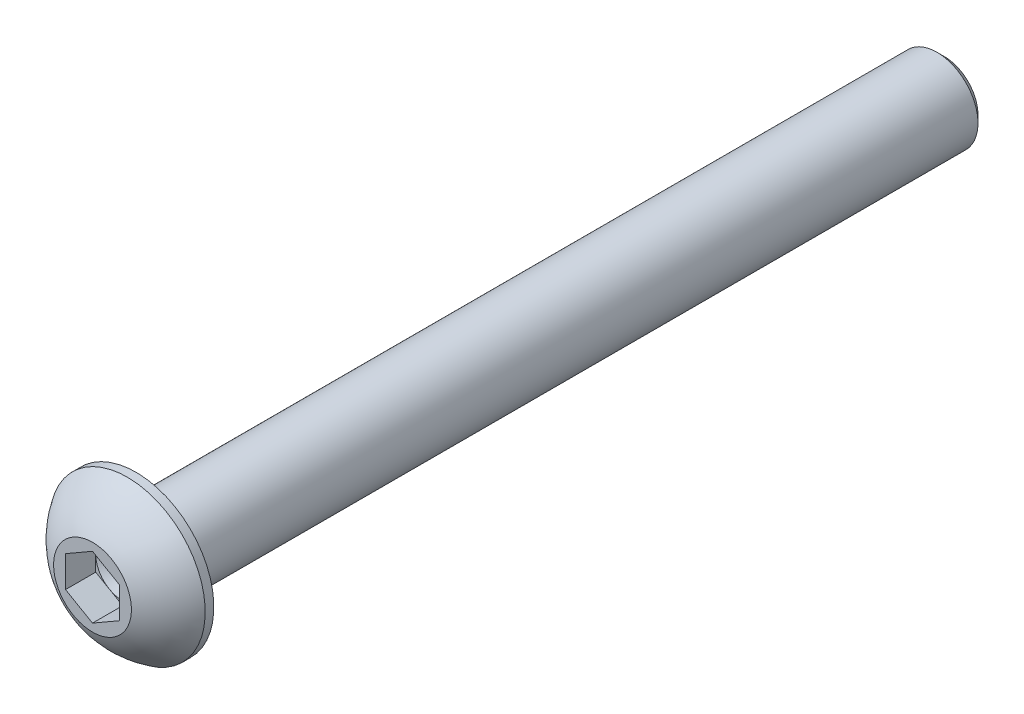
ISO-10303-21;
HEADER;
FILE_DESCRIPTION(('STEP AP214'),'2;1');
FILE_NAME('part.step','',(''),(''),'','','');
FILE_SCHEMA(('AUTOMOTIVE_DESIGN { 1 0 10303 214 1 1 1 1 }'));
ENDSEC;
DATA;
#1=APPLICATION_CONTEXT('core data for automotive mechanical design processes');
#2=APPLICATION_PROTOCOL_DEFINITION('international standard','automotive_design',2000,#1);
#3=PRODUCT_CONTEXT('',#1,'mechanical');
#4=PRODUCT('Part','Part','',(#3));
#5=PRODUCT_RELATED_PRODUCT_CATEGORY('part','',(#4));
#6=PRODUCT_DEFINITION_FORMATION('','',#4);
#7=PRODUCT_DEFINITION_CONTEXT('part definition',#1,'design');
#8=PRODUCT_DEFINITION('design','',#6,#7);
#9=PRODUCT_DEFINITION_SHAPE('','',#8);
#10=(LENGTH_UNIT() NAMED_UNIT(*) SI_UNIT(.MILLI.,.METRE.));
#11=(NAMED_UNIT(*) PLANE_ANGLE_UNIT() SI_UNIT($,.RADIAN.));
#12=(NAMED_UNIT(*) SI_UNIT($,.STERADIAN.) SOLID_ANGLE_UNIT());
#13=UNCERTAINTY_MEASURE_WITH_UNIT(LENGTH_MEASURE(1.E-05),#10,'distance_accuracy_value','');
#14=(GEOMETRIC_REPRESENTATION_CONTEXT(3) GLOBAL_UNCERTAINTY_ASSIGNED_CONTEXT((#13)) GLOBAL_UNIT_ASSIGNED_CONTEXT((#10,
#11,#12)) REPRESENTATION_CONTEXT('',''));
#15=CARTESIAN_POINT('',(0.,0.,0.));
#16=DIRECTION('',(0.,0.,1.));
#17=DIRECTION('',(1.,0.,0.));
#18=AXIS2_PLACEMENT_3D('',#15,#16,#17);
#19=CARTESIAN_POINT('',(0.,0.,-1.778));
#20=DIRECTION('',(0.,0.,1.));
#21=DIRECTION('',(1.,0.,0.));
#22=AXIS2_PLACEMENT_3D('',#19,#20,#21);
#23=PLANE('',#22);
#24=CARTESIAN_POINT('',(0.,0.,-1.778));
#25=DIRECTION('',(0.,0.,1.));
#26=DIRECTION('',(1.,0.,0.));
#27=AXIS2_PLACEMENT_3D('',#24,#25,#26);
#28=CIRCLE('',#27,1.5875);
#29=CARTESIAN_POINT('',(1.5875,0.,-1.778));
#30=VERTEX_POINT('',#29);
#31=CARTESIAN_POINT('',(0.79375,1.3748153285078,-1.778));
#32=VERTEX_POINT('',#31);
#33=EDGE_CURVE('E96',#30,#32,#28,.T.);
#34=ORIENTED_EDGE('',*,*,#33,.F.);
#35=DIRECTION('',(0.,-1.,0.));
#36=VECTOR('',#35,1.);
#37=CARTESIAN_POINT('',(1.5875,0.,-1.778));
#38=LINE('',#37,#36);
#39=CARTESIAN_POINT('',(1.5875,0.916543552338531,-1.778));
#40=VERTEX_POINT('',#39);
#41=EDGE_CURVE('E120',#40,#30,#38,.T.);
#42=ORIENTED_EDGE('',*,*,#41,.F.);
#43=DIRECTION('',(0.866025403784438,-0.5,0.));
#44=VECTOR('',#43,1.);
#45=CARTESIAN_POINT('',(0.79375,1.3748153285078,-1.778));
#46=LINE('',#45,#44);
#47=EDGE_CURVE('E118',#32,#40,#46,.T.);
#48=ORIENTED_EDGE('',*,*,#47,.F.);
#49=EDGE_LOOP('',(#34,#42,#48));
#50=FACE_BOUND('',#49,.T.);
#51=ADVANCED_FACE('F17',(#50),#23,.T.);
#52=CARTESIAN_POINT('',(-0.79375,1.37481532850779,-1.778));
#53=VERTEX_POINT('',#52);
#54=EDGE_CURVE('E98',#32,#53,#28,.T.);
#55=ORIENTED_EDGE('',*,*,#54,.F.);
#56=CARTESIAN_POINT('',(0.,1.83308710467706,-1.778));
#57=VERTEX_POINT('',#56);
#58=EDGE_CURVE('E113',#57,#32,#46,.T.);
#59=ORIENTED_EDGE('',*,*,#58,.F.);
#60=DIRECTION('',(0.866025403784437,0.5,0.));
#61=VECTOR('',#60,1.);
#62=CARTESIAN_POINT('',(-0.79375,1.37481532850779,-1.778));
#63=LINE('',#62,#61);
#64=EDGE_CURVE('E114',#53,#57,#63,.T.);
#65=ORIENTED_EDGE('',*,*,#64,.F.);
#66=EDGE_LOOP('',(#55,#59,#65));
#67=FACE_BOUND('',#66,.T.);
#68=ADVANCED_FACE('F111',(#67),#23,.T.);
#69=CARTESIAN_POINT('',(-1.5875,0.,-1.778));
#70=VERTEX_POINT('',#69);
#71=EDGE_CURVE('E117',#53,#70,#28,.T.);
#72=ORIENTED_EDGE('',*,*,#71,.F.);
#73=CARTESIAN_POINT('',(-1.5875,0.916543552338527,-1.778));
#74=VERTEX_POINT('',#73);
#75=EDGE_CURVE('E135',#74,#53,#63,.T.);
#76=ORIENTED_EDGE('',*,*,#75,.F.);
#77=DIRECTION('',(0.,1.,0.));
#78=VECTOR('',#77,1.);
#79=CARTESIAN_POINT('',(-1.5875,0.,-1.778));
#80=LINE('',#79,#78);
#81=EDGE_CURVE('E139',#70,#74,#80,.T.);
#82=ORIENTED_EDGE('',*,*,#81,.F.);
#83=EDGE_LOOP('',(#72,#76,#82));
#84=FACE_BOUND('',#83,.T.);
#85=ADVANCED_FACE('F226',(#84),#23,.T.);
#86=CARTESIAN_POINT('',(-0.79375,-1.3748153285078,-1.778));
#87=VERTEX_POINT('',#86);
#88=EDGE_CURVE('E251',#70,#87,#28,.T.);
#89=ORIENTED_EDGE('',*,*,#88,.F.);
#90=CARTESIAN_POINT('',(-1.5875,-0.916543552338531,-1.778));
#91=VERTEX_POINT('',#90);
#92=EDGE_CURVE('E140',#91,#70,#80,.T.);
#93=ORIENTED_EDGE('',*,*,#92,.F.);
#94=DIRECTION('',(-0.866025403784438,0.5,0.));
#95=VECTOR('',#94,1.);
#96=CARTESIAN_POINT('',(-0.79375,-1.3748153285078,-1.778));
#97=LINE('',#96,#95);
#98=EDGE_CURVE('E143',#87,#91,#97,.T.);
#99=ORIENTED_EDGE('',*,*,#98,.F.);
#100=EDGE_LOOP('',(#89,#93,#99));
#101=FACE_BOUND('',#100,.T.);
#102=ADVANCED_FACE('F238',(#101),#23,.T.);
#103=CARTESIAN_POINT('',(0.79375,-1.37481532850779,-1.778));
#104=VERTEX_POINT('',#103);
#105=EDGE_CURVE('E33',#87,#104,#28,.T.);
#106=ORIENTED_EDGE('',*,*,#105,.F.);
#107=CARTESIAN_POINT('',(0.,-1.83308710467706,-1.778));
#108=VERTEX_POINT('',#107);
#109=EDGE_CURVE('E144',#108,#87,#97,.T.);
#110=ORIENTED_EDGE('',*,*,#109,.F.);
#111=DIRECTION('',(-0.866025403784437,-0.5,0.));
#112=VECTOR('',#111,1.);
#113=CARTESIAN_POINT('',(0.79375,-1.37481532850779,-1.778));
#114=LINE('',#113,#112);
#115=EDGE_CURVE('E148',#104,#108,#114,.T.);
#116=ORIENTED_EDGE('',*,*,#115,.F.);
#117=EDGE_LOOP('',(#106,#110,#116));
#118=FACE_BOUND('',#117,.T.);
#119=ADVANCED_FACE('F231',(#118),#23,.T.);
#120=CARTESIAN_POINT('',(-1.146175,0.,0.));
#121=DIRECTION('',(0.,0.,1.));
#122=DIRECTION('',(1.,0.,0.));
#123=AXIS2_PLACEMENT_3D('',#120,#121,#122);
#124=PLANE('',#123);
#125=CARTESIAN_POINT('',(0.,0.,0.));
#126=DIRECTION('',(0.,0.,-1.));
#127=DIRECTION('',(-1.,0.,0.));
#128=AXIS2_PLACEMENT_3D('',#125,#126,#127);
#129=CIRCLE('',#128,2.29235);
#130=CARTESIAN_POINT('',(-2.29235000000001,0.,0.));
#131=VERTEX_POINT('',#130);
#132=EDGE_CURVE('E196',#131,#131,#129,.T.);
#133=ORIENTED_EDGE('',*,*,#132,.F.);
#134=EDGE_LOOP('',(#133));
#135=FACE_BOUND('',#134,.T.);
#136=DIRECTION('',(0.866025403784437,0.5,0.));
#137=VECTOR('',#136,1.);
#138=CARTESIAN_POINT('',(-0.79375,1.37481532850779,0.));
#139=LINE('',#138,#137);
#140=CARTESIAN_POINT('',(-1.5875,0.916543552338527,0.));
#141=VERTEX_POINT('',#140);
#142=CARTESIAN_POINT('',(0.,1.83308710467706,0.));
#143=VERTEX_POINT('',#142);
#144=EDGE_CURVE('E160',#141,#143,#139,.T.);
#145=ORIENTED_EDGE('',*,*,#144,.T.);
#146=DIRECTION('',(0.866025403784438,-0.5,0.));
#147=VECTOR('',#146,1.);
#148=CARTESIAN_POINT('',(0.79375,1.3748153285078,0.));
#149=LINE('',#148,#147);
#150=CARTESIAN_POINT('',(1.5875,0.916543552338531,0.));
#151=VERTEX_POINT('',#150);
#152=EDGE_CURVE('E106',#143,#151,#149,.T.);
#153=ORIENTED_EDGE('',*,*,#152,.T.);
#154=DIRECTION('',(0.,-1.,0.));
#155=VECTOR('',#154,1.);
#156=CARTESIAN_POINT('',(1.5875,0.,0.));
#157=LINE('',#156,#155);
#158=CARTESIAN_POINT('',(1.5875,-0.916543552338531,0.));
#159=VERTEX_POINT('',#158);
#160=EDGE_CURVE('E124',#151,#159,#157,.T.);
#161=ORIENTED_EDGE('',*,*,#160,.T.);
#162=DIRECTION('',(-0.866025403784437,-0.5,0.));
#163=VECTOR('',#162,1.);
#164=CARTESIAN_POINT('',(0.79375,-1.37481532850779,0.));
#165=LINE('',#164,#163);
#166=CARTESIAN_POINT('',(0.,-1.83308710467706,0.));
#167=VERTEX_POINT('',#166);
#168=EDGE_CURVE('E41',#159,#167,#165,.T.);
#169=ORIENTED_EDGE('',*,*,#168,.T.);
#170=DIRECTION('',(-0.866025403784438,0.5,0.));
#171=VECTOR('',#170,1.);
#172=CARTESIAN_POINT('',(-0.79375,-1.3748153285078,0.));
#173=LINE('',#172,#171);
#174=CARTESIAN_POINT('',(-1.5875,-0.916543552338531,0.));
#175=VERTEX_POINT('',#174);
#176=EDGE_CURVE('E168',#167,#175,#173,.T.);
#177=ORIENTED_EDGE('',*,*,#176,.T.);
#178=DIRECTION('',(0.,1.,0.));
#179=VECTOR('',#178,1.);
#180=CARTESIAN_POINT('',(-1.5875,0.,0.));
#181=LINE('',#180,#179);
#182=EDGE_CURVE('E164',#175,#141,#181,.T.);
#183=ORIENTED_EDGE('',*,*,#182,.T.);
#184=EDGE_LOOP('',(#145,#153,#161,#169,#177,#183));
#185=FACE_BOUND('',#184,.T.);
#186=ADVANCED_FACE('F237',(#135,#185),#124,.T.);
#187=CARTESIAN_POINT('',(0.,0.,1.48381805047393));
#188=DIRECTION('',(0.,0.,-1.));
#189=DIRECTION('',(-1.,0.,0.));
#190=AXIS2_PLACEMENT_3D('',#187,#188,#189);
#191=CYLINDRICAL_SURFACE('',#190,4.5847);
#192=CARTESIAN_POINT('',(0.,0.,-2.0574));
#193=DIRECTION('',(0.,0.,-1.));
#194=DIRECTION('',(-1.,0.,0.));
#195=AXIS2_PLACEMENT_3D('',#192,#193,#194);
#196=CIRCLE('',#195,4.5847);
#197=CARTESIAN_POINT('',(-4.5847,0.,-2.0574));
#198=VERTEX_POINT('',#197);
#199=EDGE_CURVE('E192',#198,#198,#196,.T.);
#200=ORIENTED_EDGE('',*,*,#199,.T.);
#201=EDGE_LOOP('',(#200));
#202=FACE_BOUND('',#201,.T.);
#203=CARTESIAN_POINT('',(0.,0.,-2.5654));
#204=DIRECTION('',(0.,0.,-1.));
#205=DIRECTION('',(-1.,0.,0.));
#206=AXIS2_PLACEMENT_3D('',#203,#204,#205);
#207=CIRCLE('',#206,4.5847);
#208=CARTESIAN_POINT('',(-4.5847,0.,-2.5654));
#209=VERTEX_POINT('',#208);
#210=EDGE_CURVE('E208',#209,#209,#207,.T.);
#211=ORIENTED_EDGE('',*,*,#210,.F.);
#212=EDGE_LOOP('',(#211));
#213=FACE_BOUND('',#212,.T.);
#214=ADVANCED_FACE('F243',(#202,#213),#191,.T.);
#215=CARTESIAN_POINT('',(-3.68935,0.,-2.5654));
#216=DIRECTION('',(0.,0.,-1.));
#217=DIRECTION('',(-1.,0.,0.));
#218=AXIS2_PLACEMENT_3D('',#215,#216,#217);
#219=PLANE('',#218);
#220=ORIENTED_EDGE('',*,*,#210,.T.);
#221=EDGE_LOOP('',(#220));
#222=FACE_BOUND('',#221,.T.);
#223=CARTESIAN_POINT('',(0.,0.,-2.5654));
#224=DIRECTION('',(0.,0.,-1.));
#225=DIRECTION('',(-1.,0.,0.));
#226=AXIS2_PLACEMENT_3D('',#223,#224,#225);
#227=CIRCLE('',#226,2.794);
#228=CARTESIAN_POINT('',(-2.794,0.,-2.5654));
#229=VERTEX_POINT('',#228);
#230=EDGE_CURVE('E204',#229,#229,#227,.T.);
#231=ORIENTED_EDGE('',*,*,#230,.F.);
#232=EDGE_LOOP('',(#231));
#233=FACE_BOUND('',#232,.T.);
#234=ADVANCED_FACE('F311',(#222,#233),#219,.T.);
#235=CARTESIAN_POINT('',(0.,0.,-2.9464));
#236=DIRECTION('',(0.,0.,-1.));
#237=DIRECTION('',(-1.,0.,0.));
#238=AXIS2_PLACEMENT_3D('',#235,#236,#237);
#239=TOROIDAL_SURFACE('',#238,2.794,0.381);
#240=ORIENTED_EDGE('',*,*,#230,.T.);
#241=EDGE_LOOP('',(#240));
#242=FACE_BOUND('',#241,.T.);
#243=CARTESIAN_POINT('',(0.,0.,-2.9464));
#244=DIRECTION('',(0.,0.,-1.));
#245=DIRECTION('',(-1.,0.,0.));
#246=AXIS2_PLACEMENT_3D('',#243,#244,#245);
#247=CIRCLE('',#246,2.413);
#248=CARTESIAN_POINT('',(-2.413,0.,-2.9464));
#249=VERTEX_POINT('',#248);
#250=EDGE_CURVE('E200',#249,#249,#247,.T.);
#251=ORIENTED_EDGE('',*,*,#250,.F.);
#252=EDGE_LOOP('',(#251));
#253=FACE_BOUND('',#252,.T.);
#254=ADVANCED_FACE('F319',(#242,#253),#239,.F.);
#255=CARTESIAN_POINT('',(0.,0.,1.48381805047393));
#256=DIRECTION('',(0.,0.,-1.));
#257=DIRECTION('',(-1.,0.,0.));
#258=AXIS2_PLACEMENT_3D('',#255,#256,#257);
#259=CYLINDRICAL_SURFACE('',#258,2.413);
#260=CARTESIAN_POINT('',(0.,0.,-49.76145761938));
#261=DIRECTION('',(0.,0.,-1.));
#262=DIRECTION('',(-1.,0.,0.));
#263=AXIS2_PLACEMENT_3D('',#260,#261,#262);
#264=CIRCLE('',#263,2.413);
#265=CARTESIAN_POINT('',(-2.413,0.,-49.76145761938));
#266=VERTEX_POINT('',#265);
#267=EDGE_CURVE('E11',#266,#266,#264,.F.);
#268=ORIENTED_EDGE('',*,*,#267,.T.);
#269=EDGE_LOOP('',(#268));
#270=FACE_BOUND('',#269,.T.);
#271=ORIENTED_EDGE('',*,*,#250,.T.);
#272=EDGE_LOOP('',(#271));
#273=FACE_BOUND('',#272,.T.);
#274=ADVANCED_FACE('F328',(#270,#273),#259,.T.);
#275=CARTESIAN_POINT('',(-1.2065,0.,-50.1904));
#276=DIRECTION('',(0.,0.,-1.));
#277=DIRECTION('',(-1.,0.,0.));
#278=AXIS2_PLACEMENT_3D('',#275,#276,#277);
#279=PLANE('',#278);
#280=CARTESIAN_POINT('',(0.,0.,-50.1904));
#281=DIRECTION('',(0.,0.,-1.));
#282=DIRECTION('',(-1.,0.,0.));
#283=AXIS2_PLACEMENT_3D('',#280,#281,#282);
#284=CIRCLE('',#283,1.98405761938);
#285=CARTESIAN_POINT('',(-1.98405761938,0.,-50.1904));
#286=VERTEX_POINT('',#285);
#287=EDGE_CURVE('E26',#286,#286,#284,.T.);
#288=ORIENTED_EDGE('',*,*,#287,.T.);
#289=EDGE_LOOP('',(#288));
#290=FACE_BOUND('',#289,.T.);
#291=ADVANCED_FACE('F215',(#290),#279,.T.);
#292=CARTESIAN_POINT('',(0.,0.,-4.85989606481481));
#293=DIRECTION('',(0.,0.,-1.));
#294=DIRECTION('',(-1.,0.,0.));
#295=AXIS2_PLACEMENT_3D('',#292,#293,#294);
#296=SPHERICAL_SURFACE('',#295,5.37340285883187);
#297=CARTESIAN_POINT('',(-4.5847,0.,-2.0574));
#298=CARTESIAN_POINT('',(-4.56772775071365,0.,-2.02963444466225));
#299=CARTESIAN_POINT('',(-4.55050321576171,0.,-2.00202310563314));
#300=CARTESIAN_POINT('',(-4.51555538986232,0.,-1.94711789153313));
#301=CARTESIAN_POINT('',(-4.49783209891487,0.,-1.91982401646224));
#302=CARTESIAN_POINT('',(-4.4618925763601,0.,-1.8655627616196));
#303=CARTESIAN_POINT('',(-4.44367634475278,0.,-1.83859538184787));
#304=CARTESIAN_POINT('',(-4.40675696303686,0.,-1.78499601309644));
#305=CARTESIAN_POINT('',(-4.38805381292827,0.,-1.75836402411674));
#306=CARTESIAN_POINT('',(-4.35016676527117,0.,-1.70544422925954));
#307=CARTESIAN_POINT('',(-4.33098286772266,0.,-1.67915642338203));
#308=CARTESIAN_POINT('',(-4.29214065809995,0.,-1.62693367141508));
#309=CARTESIAN_POINT('',(-4.27248234602574,0.,-1.60099872532564));
#310=CARTESIAN_POINT('',(-4.23269779601254,0.,-1.54949025368841));
#311=CARTESIAN_POINT('',(-4.21257155807355,0.,-1.52391672814064));
#312=CARTESIAN_POINT('',(-4.17185779967265,0.,-1.4731395388975));
#313=CARTESIAN_POINT('',(-4.15127027921075,0.,-1.44793587520214));
#314=CARTESIAN_POINT('',(-4.10964075130566,0.,-1.39790672892889));
#315=CARTESIAN_POINT('',(-4.08859874386249,0.,-1.37308124635099));
#316=CARTESIAN_POINT('',(-4.04606718757048,0.,-1.32381665673685));
#317=CARTESIAN_POINT('',(-4.02457763872164,0.,-1.29937754970059));
#318=CARTESIAN_POINT('',(-3.98115809291457,0.,-1.25089377806135));
#319=CARTESIAN_POINT('',(-3.95922809595633,0.,-1.22684911345837));
#320=CARTESIAN_POINT('',(-3.91493489261154,0.,-1.1791621633785));
#321=CARTESIAN_POINT('',(-3.892571686225,0.,-1.15551987790161));
#322=CARTESIAN_POINT('',(-3.84741944569869,0.,-1.10864548994917));
#323=CARTESIAN_POINT('',(-3.82463041155893,0.,-1.08541338747362));
#324=CARTESIAN_POINT('',(-3.77863403775912,0.,-1.03936703400529));
#325=CARTESIAN_POINT('',(-3.75542669809908,0.,-1.01655278301252));
#326=CARTESIAN_POINT('',(-3.70860137356642,0.,-0.971349663066289));
#327=CARTESIAN_POINT('',(-3.68498338869382,0.,-0.94896079411283));
#328=CARTESIAN_POINT('',(-3.63734456959005,0.,-0.904615828391113));
#329=CARTESIAN_POINT('',(-3.61332373535889,0.,-0.882659731622856));
#330=CARTESIAN_POINT('',(-3.56488714636506,0.,-0.839187557567447));
#331=CARTESIAN_POINT('',(-3.54047139160238,0.,-0.817671480280295));
#332=CARTESIAN_POINT('',(-3.4912530207284,0.,-0.775086447240822));
#333=CARTESIAN_POINT('',(-3.4664504046171,0.,-0.754017491488501));
#334=CARTESIAN_POINT('',(-3.41646649792444,0.,-0.712333655985979));
#335=CARTESIAN_POINT('',(-3.39128520734309,0.,-0.691718776235777));
#336=CARTESIAN_POINT('',(-3.34055226358225,0.,-0.650949897322802));
#337=CARTESIAN_POINT('',(-3.31500061040276,0.,-0.630795898160027));
#338=CARTESIAN_POINT('',(-3.26353537556731,0.,-0.590955432879197));
#339=CARTESIAN_POINT('',(-3.23762179391134,0.,-0.57126896676114));
#340=CARTESIAN_POINT('',(-3.18544125571044,0.,-0.532370065703055));
#341=CARTESIAN_POINT('',(-3.15917429916551,0.,-0.513157630763025));
#342=CARTESIAN_POINT('',(-3.10629568141643,0.,-0.475213133725829));
#343=CARTESIAN_POINT('',(-3.07968402021229,0.,-0.456481071628663));
#344=CARTESIAN_POINT('',(-3.02612477715573,0.,-0.419503503378719));
#345=CARTESIAN_POINT('',(-2.99917719530331,0.,-0.40125799722594));
#346=CARTESIAN_POINT('',(-2.94495500583993,0.,-0.365259563367945));
#347=CARTESIAN_POINT('',(-2.91768039822897,0.,-0.347506635662729));
#348=CARTESIAN_POINT('',(-2.8628131600919,0.,-0.312499218594777));
#349=CARTESIAN_POINT('',(-2.83522052956579,0.,-0.295244729232041));
#350=CARTESIAN_POINT('',(-2.77972635338319,0.,-0.261239884283562));
#351=CARTESIAN_POINT('',(-2.75182480772671,0.,-0.244489528697819));
#352=CARTESIAN_POINT('',(-2.69572201115466,0.,-0.211498480091079));
#353=CARTESIAN_POINT('',(-2.6675207602391,0.,-0.195257787070081));
#354=CARTESIAN_POINT('',(-2.61082786150165,0.,-0.163291425052401));
#355=CARTESIAN_POINT('',(-2.58233621367977,0.,-0.147565756055718));
#356=CARTESIAN_POINT('',(-2.52507192700006,0.,-0.116634630180611));
#357=CARTESIAN_POINT('',(-2.49629928814224,0.,-0.101429173302187));
#358=CARTESIAN_POINT('',(-2.43848251180434,0.,-0.0715435006068001));
#359=CARTESIAN_POINT('',(-2.40943837432427,0.,-0.0568632847898376));
#360=CARTESIAN_POINT('',(-2.35108820593536,0.,-0.0280329029080984));
#361=CARTESIAN_POINT('',(-2.32178217502651,0.,-0.0138827368433216));
#362=CARTESIAN_POINT('',(-2.29235000000001,0.,0.));
#363=B_SPLINE_CURVE_WITH_KNOTS('',3,(#297,#298,#299,#300,#301,#302,#303,#304,#305,#306,#307,
#308,#309,#310,#311,#312,#313,#314,#315,#316,#317,#318,#319,#320,#321,#322,#323,#324,#325,#326,
#327,#328,#329,#330,#331,#332,#333,#334,#335,#336,#337,#338,#339,#340,#341,#342,#343,#344,#345,
#346,#347,#348,#349,#350,#351,#352,#353,#354,#355,#356,#357,#358,#359,#360,#361,#362),
.UNSPECIFIED.,.F.,.F.,(4,2,2,2,2,2,2,2,2,2,2,2,2,2,2,2,2,2,2,2,2,2,2,2,2,2,2,2,2,2,2,2,4),(0.,
0.09762472664678,0.195249453293559,0.292874179940339,0.390498906587117,0.488123633233897,
0.585748359880676,0.683373086527455,0.780997813174235,0.878622539821013,0.976247266467793,
1.07387199311457,1.17149671976135,1.26912144640813,1.36674617305491,1.46437089970169,
1.56199562634847,1.65962035299525,1.75724507964203,1.85486980628881,1.95249453293559,
2.05011925958237,2.14774398622914,2.24536871287592,2.3429934395227,2.44061816616948,
2.53824289281626,2.63586761946304,2.73349234610982,2.8311170727566,2.92874179940338,
3.02636652605016,3.12399125269694),.UNSPECIFIED.);
#364=EDGE_CURVE('BSEAM345',#198,#131,#363,.T.);
#365=ORIENTED_EDGE('',*,*,#199,.F.);
#366=ORIENTED_EDGE('',*,*,#132,.T.);
#367=ORIENTED_EDGE('',*,*,#364,.T.);
#368=ORIENTED_EDGE('',*,*,#364,.F.);
#369=EDGE_LOOP('',(#365,#367,#366,#368));
#370=FACE_BOUND('',#369,.T.);
#371=ADVANCED_FACE('F345',(#370),#296,.T.);
#372=CARTESIAN_POINT('',(0.79375,1.3748153285078,-1.778));
#373=DIRECTION('',(-0.5,-0.866025403784438,0.));
#374=DIRECTION('',(0.866025403784438,-0.5,0.));
#375=AXIS2_PLACEMENT_3D('',#372,#373,#374);
#376=PLANE('',#375);
#377=ORIENTED_EDGE('',*,*,#152,.F.);
#378=DIRECTION('',(0.,0.,1.));
#379=VECTOR('',#378,1.);
#380=CARTESIAN_POINT('',(0.,1.83308710467706,-1.778));
#381=LINE('',#380,#379);
#382=EDGE_CURVE('E129',#57,#143,#381,.T.);
#383=ORIENTED_EDGE('',*,*,#382,.F.);
#384=ORIENTED_EDGE('',*,*,#58,.T.);
#385=ORIENTED_EDGE('',*,*,#47,.T.);
#386=DIRECTION('',(0.,0.,1.));
#387=VECTOR('',#386,1.);
#388=CARTESIAN_POINT('',(1.5875,0.916543552338531,-1.778));
#389=LINE('',#388,#387);
#390=EDGE_CURVE('E156',#40,#151,#389,.T.);
#391=ORIENTED_EDGE('',*,*,#390,.T.);
#392=EDGE_LOOP('',(#377,#383,#384,#385,#391));
#393=FACE_BOUND('',#392,.T.);
#394=ADVANCED_FACE('F128',(#393),#376,.T.);
#395=CARTESIAN_POINT('',(-0.79375,1.37481532850779,-1.778));
#396=DIRECTION('',(0.5,-0.866025403784437,0.));
#397=DIRECTION('',(0.866025403784437,0.5,0.));
#398=AXIS2_PLACEMENT_3D('',#395,#396,#397);
#399=PLANE('',#398);
#400=ORIENTED_EDGE('',*,*,#144,.F.);
#401=DIRECTION('',(0.,0.,1.));
#402=VECTOR('',#401,1.);
#403=CARTESIAN_POINT('',(-1.5875,0.916543552338527,-1.778));
#404=LINE('',#403,#402);
#405=EDGE_CURVE('E187',#74,#141,#404,.T.);
#406=ORIENTED_EDGE('',*,*,#405,.F.);
#407=ORIENTED_EDGE('',*,*,#75,.T.);
#408=ORIENTED_EDGE('',*,*,#64,.T.);
#409=ORIENTED_EDGE('',*,*,#382,.T.);
#410=EDGE_LOOP('',(#400,#406,#407,#408,#409));
#411=FACE_BOUND('',#410,.T.);
#412=ADVANCED_FACE('F275',(#411),#399,.T.);
#413=CARTESIAN_POINT('',(-1.5875,0.,-1.778));
#414=DIRECTION('',(1.,0.,0.));
#415=DIRECTION('',(0.,0.,-1.));
#416=AXIS2_PLACEMENT_3D('',#413,#414,#415);
#417=PLANE('',#416);
#418=ORIENTED_EDGE('',*,*,#182,.F.);
#419=DIRECTION('',(0.,0.,1.));
#420=VECTOR('',#419,1.);
#421=CARTESIAN_POINT('',(-1.5875,-0.916543552338531,-1.778));
#422=LINE('',#421,#420);
#423=EDGE_CURVE('E185',#91,#175,#422,.T.);
#424=ORIENTED_EDGE('',*,*,#423,.F.);
#425=ORIENTED_EDGE('',*,*,#92,.T.);
#426=ORIENTED_EDGE('',*,*,#81,.T.);
#427=ORIENTED_EDGE('',*,*,#405,.T.);
#428=EDGE_LOOP('',(#418,#424,#425,#426,#427));
#429=FACE_BOUND('',#428,.T.);
#430=ADVANCED_FACE('F270',(#429),#417,.T.);
#431=CARTESIAN_POINT('',(-0.79375,-1.3748153285078,-1.778));
#432=DIRECTION('',(0.5,0.866025403784438,0.));
#433=DIRECTION('',(-0.866025403784438,0.5,0.));
#434=AXIS2_PLACEMENT_3D('',#431,#432,#433);
#435=PLANE('',#434);
#436=ORIENTED_EDGE('',*,*,#176,.F.);
#437=DIRECTION('',(0.,0.,1.));
#438=VECTOR('',#437,1.);
#439=CARTESIAN_POINT('',(0.,-1.83308710467706,-1.778));
#440=LINE('',#439,#438);
#441=EDGE_CURVE('E182',#108,#167,#440,.T.);
#442=ORIENTED_EDGE('',*,*,#441,.F.);
#443=ORIENTED_EDGE('',*,*,#109,.T.);
#444=ORIENTED_EDGE('',*,*,#98,.T.);
#445=ORIENTED_EDGE('',*,*,#423,.T.);
#446=EDGE_LOOP('',(#436,#442,#443,#444,#445));
#447=FACE_BOUND('',#446,.T.);
#448=ADVANCED_FACE('F260',(#447),#435,.T.);
#449=CARTESIAN_POINT('',(0.79375,-1.37481532850779,-1.778));
#450=DIRECTION('',(-0.5,0.866025403784437,0.));
#451=DIRECTION('',(-0.866025403784437,-0.5,0.));
#452=AXIS2_PLACEMENT_3D('',#449,#450,#451);
#453=PLANE('',#452);
#454=ORIENTED_EDGE('',*,*,#168,.F.);
#455=DIRECTION('',(0.,0.,1.));
#456=VECTOR('',#455,1.);
#457=CARTESIAN_POINT('',(1.5875,-0.916543552338531,-1.778));
#458=LINE('',#457,#456);
#459=CARTESIAN_POINT('',(1.5875,-0.916543552338531,-1.778));
#460=VERTEX_POINT('',#459);
#461=EDGE_CURVE('E179',#460,#159,#458,.T.);
#462=ORIENTED_EDGE('',*,*,#461,.F.);
#463=EDGE_CURVE('E149',#460,#104,#114,.T.);
#464=ORIENTED_EDGE('',*,*,#463,.T.);
#465=ORIENTED_EDGE('',*,*,#115,.T.);
#466=ORIENTED_EDGE('',*,*,#441,.T.);
#467=EDGE_LOOP('',(#454,#462,#464,#465,#466));
#468=FACE_BOUND('',#467,.T.);
#469=ADVANCED_FACE('F234',(#468),#453,.T.);
#470=CARTESIAN_POINT('',(1.5875,0.,-1.778));
#471=DIRECTION('',(-1.,0.,0.));
#472=DIRECTION('',(0.,0.,1.));
#473=AXIS2_PLACEMENT_3D('',#470,#471,#472);
#474=PLANE('',#473);
#475=ORIENTED_EDGE('',*,*,#160,.F.);
#476=ORIENTED_EDGE('',*,*,#390,.F.);
#477=ORIENTED_EDGE('',*,*,#41,.T.);
#478=EDGE_CURVE('E153',#30,#460,#38,.T.);
#479=ORIENTED_EDGE('',*,*,#478,.T.);
#480=ORIENTED_EDGE('',*,*,#461,.T.);
#481=EDGE_LOOP('',(#475,#476,#477,#479,#480));
#482=FACE_BOUND('',#481,.T.);
#483=ADVANCED_FACE('F229',(#482),#474,.T.);
#484=EDGE_CURVE('E100',#104,#30,#28,.T.);
#485=ORIENTED_EDGE('',*,*,#484,.F.);
#486=ORIENTED_EDGE('',*,*,#463,.F.);
#487=ORIENTED_EDGE('',*,*,#478,.F.);
#488=EDGE_LOOP('',(#485,#486,#487));
#489=FACE_BOUND('',#488,.T.);
#490=ADVANCED_FACE('F93',(#489),#23,.T.);
#491=CARTESIAN_POINT('',(0.,0.,-1.778));
#492=DIRECTION('',(0.,0.,1.));
#493=DIRECTION('',(1.,0.,0.));
#494=AXIS2_PLACEMENT_3D('',#491,#492,#493);
#495=CONICAL_SURFACE('',#494,1.5875,1.0471975511966);
#496=CARTESIAN_POINT('',(0.,0.,-2.69454355233854));
#497=VERTEX_POINT('',#496);
#498=VERTEX_LOOP('',#497);
#499=FACE_BOUND('',#498,.T.);
#500=ORIENTED_EDGE('',*,*,#33,.T.);
#501=ORIENTED_EDGE('',*,*,#54,.T.);
#502=ORIENTED_EDGE('',*,*,#71,.T.);
#503=ORIENTED_EDGE('',*,*,#88,.T.);
#504=ORIENTED_EDGE('',*,*,#105,.T.);
#505=ORIENTED_EDGE('',*,*,#484,.T.);
#506=EDGE_LOOP('',(#500,#501,#502,#503,#504,#505));
#507=FACE_BOUND('',#506,.T.);
#508=ADVANCED_FACE('F91',(#499,#507),#495,.F.);
#509=CARTESIAN_POINT('',(0.,0.,-50.1904));
#510=DIRECTION('',(0.,0.,1.));
#511=DIRECTION('',(1.,0.,0.));
#512=AXIS2_PLACEMENT_3D('',#509,#510,#511);
#513=CONICAL_SURFACE('',#512,1.98405761938,0.785398163397445);
#514=ORIENTED_EDGE('',*,*,#267,.F.);
#515=EDGE_LOOP('',(#514));
#516=FACE_BOUND('',#515,.T.);
#517=ORIENTED_EDGE('',*,*,#287,.F.);
#518=EDGE_LOOP('',(#517));
#519=FACE_BOUND('',#518,.T.);
#520=ADVANCED_FACE('F19',(#516,#519),#513,.T.);
#521=CLOSED_SHELL('',(#51,#68,#85,#102,#119,#186,#214,#234,#254,#274,#291,#371,#394,#412,#430,
#448,#469,#483,#490,#508,#520));
#522=MANIFOLD_SOLID_BREP('B1',#521);
#523=ADVANCED_BREP_SHAPE_REPRESENTATION('',(#18,#522),#14);
#524=SHAPE_DEFINITION_REPRESENTATION(#9,#523);
ENDSEC;
END-ISO-10303-21;
